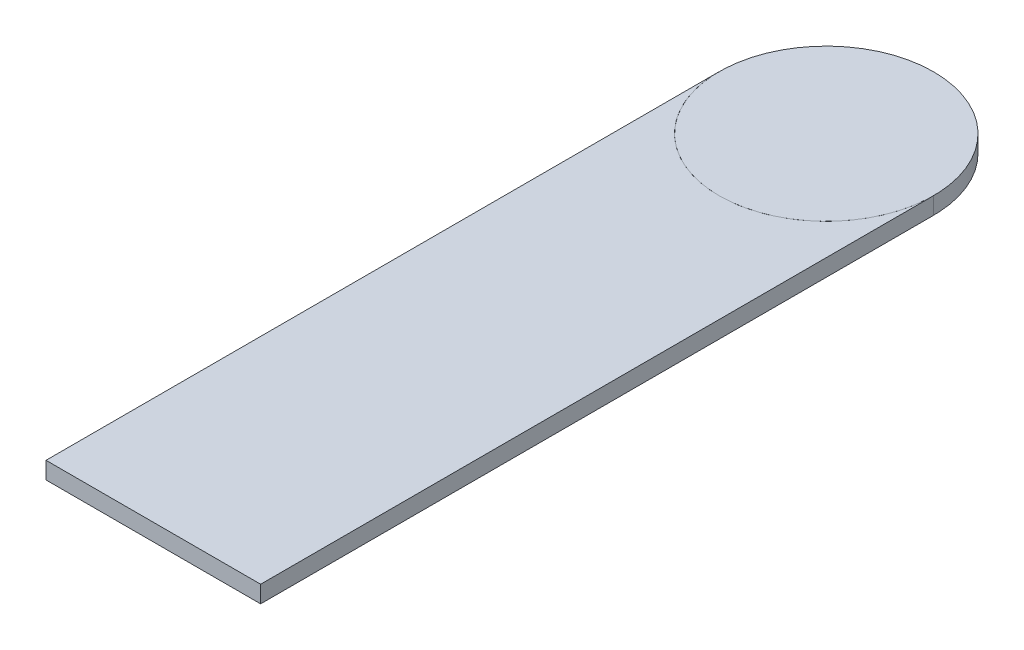
ISO-10303-21;
HEADER;
FILE_DESCRIPTION(('STEP AP214'),'2;1');
FILE_NAME('part.step','',(''),(''),'','','');
FILE_SCHEMA(('AUTOMOTIVE_DESIGN { 1 0 10303 214 1 1 1 1 }'));
ENDSEC;
DATA;
#1=APPLICATION_CONTEXT('core data for automotive mechanical design processes');
#2=APPLICATION_PROTOCOL_DEFINITION('international standard','automotive_design',2000,#1);
#3=PRODUCT_CONTEXT('',#1,'mechanical');
#4=PRODUCT('Part','Part','',(#3));
#5=PRODUCT_RELATED_PRODUCT_CATEGORY('part','',(#4));
#6=PRODUCT_DEFINITION_FORMATION('','',#4);
#7=PRODUCT_DEFINITION_CONTEXT('part definition',#1,'design');
#8=PRODUCT_DEFINITION('design','',#6,#7);
#9=PRODUCT_DEFINITION_SHAPE('','',#8);
#10=(LENGTH_UNIT() NAMED_UNIT(*) SI_UNIT(.MILLI.,.METRE.));
#11=(NAMED_UNIT(*) PLANE_ANGLE_UNIT() SI_UNIT($,.RADIAN.));
#12=(NAMED_UNIT(*) SI_UNIT($,.STERADIAN.) SOLID_ANGLE_UNIT());
#13=UNCERTAINTY_MEASURE_WITH_UNIT(LENGTH_MEASURE(1.E-05),#10,'distance_accuracy_value','');
#14=(GEOMETRIC_REPRESENTATION_CONTEXT(3) GLOBAL_UNCERTAINTY_ASSIGNED_CONTEXT((#13)) GLOBAL_UNIT_ASSIGNED_CONTEXT((#10,
#11,#12)) REPRESENTATION_CONTEXT('',''));
#15=CARTESIAN_POINT('',(0.,0.,0.));
#16=DIRECTION('',(0.,0.,1.));
#17=DIRECTION('',(1.,0.,0.));
#18=AXIS2_PLACEMENT_3D('',#15,#16,#17);
#19=CARTESIAN_POINT('',(-62.9999633347651,-0.01,0.057969244940258));
#20=DIRECTION('',(-1.,0.,0.));
#21=DIRECTION('',(0.,0.,1.));
#22=AXIS2_PLACEMENT_3D('',#19,#20,#21);
#23=PLANE('',#22);
#24=DIRECTION('',(0.,0.,1.));
#25=VECTOR('',#24,1.);
#26=CARTESIAN_POINT('',(-62.9999633347651,10.,197.56796924494));
#27=LINE('',#26,#25);
#28=CARTESIAN_POINT('',(-62.9999633347651,10.,0.0679692449402471));
#29=VERTEX_POINT('',#28);
#30=CARTESIAN_POINT('',(-62.9999633347651,10.,395.06796924494));
#31=VERTEX_POINT('',#30);
#32=EDGE_CURVE('P0_E73',#29,#31,#27,.T.);
#33=ORIENTED_EDGE('',*,*,#32,.F.);
#34=DIRECTION('',(0.,1.,0.));
#35=VECTOR('',#34,1.);
#36=CARTESIAN_POINT('',(-62.9999633347651,5.,0.0679692449402497));
#37=LINE('',#36,#35);
#38=CARTESIAN_POINT('',(-62.9999633347651,0.,0.0679692449402471));
#39=VERTEX_POINT('',#38);
#40=EDGE_CURVE('P0_E72',#39,#29,#37,.T.);
#41=ORIENTED_EDGE('',*,*,#40,.F.);
#42=DIRECTION('',(0.,0.,-1.));
#43=VECTOR('',#42,1.);
#44=CARTESIAN_POINT('',(-62.9999633347651,0.,197.56796924494));
#45=LINE('',#44,#43);
#46=CARTESIAN_POINT('',(-62.9999633347651,0.,395.06796924494));
#47=VERTEX_POINT('',#46);
#48=EDGE_CURVE('P0_E58',#47,#39,#45,.T.);
#49=ORIENTED_EDGE('',*,*,#48,.F.);
#50=DIRECTION('',(0.,-1.,0.));
#51=VECTOR('',#50,1.);
#52=CARTESIAN_POINT('',(-62.9999633347651,5.,395.06796924494));
#53=LINE('',#52,#51);
#54=EDGE_CURVE('P0_E130',#31,#47,#53,.T.);
#55=ORIENTED_EDGE('',*,*,#54,.F.);
#56=EDGE_LOOP('',(#33,#41,#49,#55));
#57=FACE_BOUND('',#56,.T.);
#58=ADVANCED_FACE('P0_F17',(#57),#23,.T.);
#59=CARTESIAN_POINT('',(63.0100366652349,0.,395.07796924494));
#60=DIRECTION('',(0.,-1.,0.));
#61=DIRECTION('',(-1.,0.,0.));
#62=AXIS2_PLACEMENT_3D('',#59,#60,#61);
#63=PLANE('',#62);
#64=DIRECTION('',(1.,0.,0.));
#65=VECTOR('',#64,1.);
#66=CARTESIAN_POINT('',(3.66652348968155E-05,0.,395.06796924494));
#67=LINE('',#66,#65);
#68=CARTESIAN_POINT('',(63.0000366652349,0.,395.06796924494));
#69=VERTEX_POINT('',#68);
#70=EDGE_CURVE('P0_E66',#47,#69,#67,.T.);
#71=ORIENTED_EDGE('',*,*,#70,.F.);
#72=ORIENTED_EDGE('',*,*,#48,.T.);
#73=CARTESIAN_POINT('',(0.,0.,0.));
#74=DIRECTION('',(0.,-1.,0.));
#75=DIRECTION('',(0.999999418012144,0.,0.0010788769038152));
#76=AXIS2_PLACEMENT_3D('',#73,#74,#75);
#77=CIRCLE('',#76,63.0000000000001);
#78=CARTESIAN_POINT('',(63.,0.,0.0679692449402843));
#79=VERTEX_POINT('',#78);
#80=EDGE_CURVE('P0_E62',#79,#39,#77,.T.);
#81=ORIENTED_EDGE('',*,*,#80,.F.);
#82=DIRECTION('',(0.,0.,-1.));
#83=VECTOR('',#82,1.);
#84=CARTESIAN_POINT('',(63.0000366652349,0.,197.56796924494));
#85=LINE('',#84,#83);
#86=EDGE_CURVE('P0_E132',#69,#79,#85,.T.);
#87=ORIENTED_EDGE('',*,*,#86,.F.);
#88=EDGE_LOOP('',(#71,#72,#81,#87));
#89=FACE_BOUND('',#88,.T.);
#90=ADVANCED_FACE('P0_F60',(#89),#63,.T.);
#91=CARTESIAN_POINT('',(0.,0.,0.));
#92=DIRECTION('',(0.,1.,0.));
#93=DIRECTION('',(0.,0.,1.));
#94=AXIS2_PLACEMENT_3D('',#91,#92,#93);
#95=CYLINDRICAL_SURFACE('',#94,63.0000000000001);
#96=CARTESIAN_POINT('',(62.9999633347651,10.,0.0679692449402913));
#97=CARTESIAN_POINT('',(62.9932738756067,10.,6.26835711270657));
#98=CARTESIAN_POINT('',(61.7778425082998,10.,12.3490151437154));
#99=CARTESIAN_POINT('',(60.5625723275097,10.,18.4288667778235));
#100=CARTESIAN_POINT('',(58.1848834643215,10.,24.1561448961404));
#101=CARTESIAN_POINT('',(55.8076163662215,10.,29.8824070842414));
#102=CARTESIAN_POINT('',(52.3589726078837,10.,35.0362382034214));
#103=CARTESIAN_POINT('',(48.9109405855209,10.,40.1891551128061));
#104=CARTESIAN_POINT('',(44.5236899726919,10.,44.571751493694));
#105=CARTESIAN_POINT('',(40.1372175900126,10.,48.9535704700207));
#106=CARTESIAN_POINT('',(34.9797289265023,10.,52.3967419237916));
#107=CARTESIAN_POINT('',(29.8231551205053,10.,55.8393026130064));
#108=CARTESIAN_POINT('',(24.0933565106366,10.,58.2109111082395));
#109=CARTESIAN_POINT('',(18.3645742764744,10.,60.582098917612));
#110=CARTESIAN_POINT('',(12.2823572692889,10.,61.791129621569));
#111=CARTESIAN_POINT('',(6.20121915170287,10.,62.9999458625021));
#112=CARTESIAN_POINT('',(0.,10.,63.));
#113=CARTESIAN_POINT('',(-6.20014439654941,10.,63.0000541281151));
#114=CARTESIAN_POINT('',(-12.282357269289,10.,61.791129621569));
#115=CARTESIAN_POINT('',(-18.3635398119834,10.,60.5824099074673));
#116=CARTESIAN_POINT('',(-24.0933565106366,10.,58.2109111082395));
#117=CARTESIAN_POINT('',(-29.8222034703282,10.,55.8398136717261));
#118=CARTESIAN_POINT('',(-34.9797289265023,10.,52.3967419237916));
#119=CARTESIAN_POINT('',(-40.1364016925297,10.,48.9542394165478));
#120=CARTESIAN_POINT('',(-44.5236899726919,10.,44.571751493694));
#121=CARTESIAN_POINT('',(-48.9102528996809,10.,40.1899881303672));
#122=CARTESIAN_POINT('',(-52.3589726078837,10.,35.0362382034214));
#123=CARTESIAN_POINT('',(-55.8071086409001,10.,29.88336051783));
#124=CARTESIAN_POINT('',(-58.1848834643215,10.,24.1561448961403));
#125=CARTESIAN_POINT('',(-60.5622554919641,10.,18.4298994665203));
#126=CARTESIAN_POINT('',(-61.7778425082998,10.,12.3490151437154));
#127=CARTESIAN_POINT('',(-62.9932732764757,10.,6.26891244079664));
#128=CARTESIAN_POINT('',(-62.9999633347651,10.,0.0679692449402358));
#129=B_SPLINE_CURVE_WITH_KNOTS('',2,(#96,#97,#98,#99,#100,#101,#102,#103,#104,#105,#106,#107,
#108,#109,#110,#111,#112,#113,#114,#115,#116,#117,#118,#119,#120,#121,#122,#123,#124,#125,#126,
#127,#128),.UNSPECIFIED.,.F.,.F.,(3,2,2,2,2,2,2,2,2,2,2,2,2,2,2,2,3),(0.,0.0625,0.125,0.1875,
0.25,0.3125,0.375,0.4375,0.5,0.5625,0.625,0.6875,0.75,0.8125,0.875,0.9375,1.),.UNSPECIFIED.);
#130=CARTESIAN_POINT('',(63.,10.,0.0679692449402843));
#131=VERTEX_POINT('',#130);
#132=EDGE_CURVE('P0_E76',#131,#29,#129,.T.);
#133=ORIENTED_EDGE('',*,*,#132,.F.);
#134=CARTESIAN_POINT('',(63.0000366652349,0.,0.0679691658258541));
#135=DIRECTION('',(0.,1.,0.));
#136=VECTOR('',#135,1.);
#137=LINE('',#134,#136);
#138=EDGE_CURVE('P0_E81',#79,#131,#137,.T.);
#139=ORIENTED_EDGE('',*,*,#138,.F.);
#140=ORIENTED_EDGE('',*,*,#80,.T.);
#141=ORIENTED_EDGE('',*,*,#40,.T.);
#142=EDGE_LOOP('',(#133,#139,#140,#141));
#143=FACE_BOUND('',#142,.T.);
#144=ADVANCED_FACE('P0_F79',(#143),#95,.F.);
#145=CARTESIAN_POINT('',(-63.0099633347651,10.,395.07796924494));
#146=DIRECTION('',(0.,1.,0.));
#147=DIRECTION('',(1.,0.,0.));
#148=AXIS2_PLACEMENT_3D('',#145,#146,#147);
#149=PLANE('',#148);
#150=DIRECTION('',(-1.,0.,0.));
#151=VECTOR('',#150,1.);
#152=CARTESIAN_POINT('',(3.66652348968155E-05,10.,395.06796924494));
#153=LINE('',#152,#151);
#154=CARTESIAN_POINT('',(63.0000366652349,10.,395.06796924494));
#155=VERTEX_POINT('',#154);
#156=EDGE_CURVE('P0_E38',#155,#31,#153,.T.);
#157=ORIENTED_EDGE('',*,*,#156,.F.);
#158=DIRECTION('',(0.,0.,1.));
#159=VECTOR('',#158,1.);
#160=CARTESIAN_POINT('',(63.0000366652349,10.,197.56796924494));
#161=LINE('',#160,#159);
#162=EDGE_CURVE('P0_E29',#131,#155,#161,.T.);
#163=ORIENTED_EDGE('',*,*,#162,.F.);
#164=ORIENTED_EDGE('',*,*,#132,.T.);
#165=ORIENTED_EDGE('',*,*,#32,.T.);
#166=EDGE_LOOP('',(#157,#163,#164,#165));
#167=FACE_BOUND('',#166,.T.);
#168=ADVANCED_FACE('P0_F102',(#167),#149,.T.);
#169=CARTESIAN_POINT('',(-63.0099633347651,-0.01,395.06796924494));
#170=DIRECTION('',(0.,0.,1.));
#171=DIRECTION('',(1.,0.,0.));
#172=AXIS2_PLACEMENT_3D('',#169,#170,#171);
#173=PLANE('',#172);
#174=ORIENTED_EDGE('',*,*,#156,.T.);
#175=ORIENTED_EDGE('',*,*,#54,.T.);
#176=ORIENTED_EDGE('',*,*,#70,.T.);
#177=DIRECTION('',(0.,-1.,0.));
#178=VECTOR('',#177,1.);
#179=CARTESIAN_POINT('',(63.0000366652349,5.,395.06796924494));
#180=LINE('',#179,#178);
#181=EDGE_CURVE('P0_E11',#155,#69,#180,.T.);
#182=ORIENTED_EDGE('',*,*,#181,.F.);
#183=EDGE_LOOP('',(#174,#175,#176,#182));
#184=FACE_BOUND('',#183,.T.);
#185=ADVANCED_FACE('P0_F161',(#184),#173,.T.);
#186=CARTESIAN_POINT('',(63.0000366652349,-0.01,395.07796924494));
#187=DIRECTION('',(1.,0.,0.));
#188=DIRECTION('',(0.,0.,-1.));
#189=AXIS2_PLACEMENT_3D('',#186,#187,#188);
#190=PLANE('',#189);
#191=ORIENTED_EDGE('',*,*,#162,.T.);
#192=ORIENTED_EDGE('',*,*,#181,.T.);
#193=ORIENTED_EDGE('',*,*,#86,.T.);
#194=ORIENTED_EDGE('',*,*,#138,.T.);
#195=EDGE_LOOP('',(#191,#192,#193,#194));
#196=FACE_BOUND('',#195,.T.);
#197=ADVANCED_FACE('P0_F19',(#196),#190,.T.);
#198=CLOSED_SHELL('',(#58,#90,#144,#168,#185,#197));
#199=MANIFOLD_SOLID_BREP('P0_B1',#198);
#200=CARTESIAN_POINT('',(-63.01,10.,63.01));
#201=DIRECTION('',(0.,1.,0.));
#202=DIRECTION('',(1.,0.,0.));
#203=AXIS2_PLACEMENT_3D('',#200,#201,#202);
#204=PLANE('',#203);
#205=CARTESIAN_POINT('',(0.,10.,0.));
#206=DIRECTION('',(0.,-1.,0.));
#207=DIRECTION('',(0.,0.,-1.));
#208=AXIS2_PLACEMENT_3D('',#205,#206,#207);
#209=CIRCLE('',#208,63.);
#210=CARTESIAN_POINT('',(0.,10.,-63.));
#211=VERTEX_POINT('',#210);
#212=EDGE_CURVE('P1_E19',#211,#211,#209,.T.);
#213=ORIENTED_EDGE('',*,*,#212,.F.);
#214=EDGE_LOOP('',(#213));
#215=FACE_BOUND('',#214,.T.);
#216=ADVANCED_FACE('P1_F15',(#215),#204,.T.);
#217=CARTESIAN_POINT('',(63.01,0.,63.01));
#218=DIRECTION('',(0.,-1.,0.));
#219=DIRECTION('',(-1.,0.,0.));
#220=AXIS2_PLACEMENT_3D('',#217,#218,#219);
#221=PLANE('',#220);
#222=CARTESIAN_POINT('',(0.,0.,0.));
#223=DIRECTION('',(0.,-1.,0.));
#224=DIRECTION('',(0.,0.,-1.));
#225=AXIS2_PLACEMENT_3D('',#222,#223,#224);
#226=CIRCLE('',#225,63.);
#227=CARTESIAN_POINT('',(0.,0.,-63.));
#228=VERTEX_POINT('',#227);
#229=EDGE_CURVE('P1_E10',#228,#228,#226,.F.);
#230=ORIENTED_EDGE('',*,*,#229,.F.);
#231=EDGE_LOOP('',(#230));
#232=FACE_BOUND('',#231,.T.);
#233=ADVANCED_FACE('P1_F30',(#232),#221,.T.);
#234=CARTESIAN_POINT('',(0.,10.,0.));
#235=DIRECTION('',(0.,-1.,0.));
#236=DIRECTION('',(0.,0.,-1.));
#237=AXIS2_PLACEMENT_3D('',#234,#235,#236);
#238=CYLINDRICAL_SURFACE('',#237,63.);
#239=ORIENTED_EDGE('',*,*,#229,.T.);
#240=EDGE_LOOP('',(#239));
#241=FACE_BOUND('',#240,.T.);
#242=ORIENTED_EDGE('',*,*,#212,.T.);
#243=EDGE_LOOP('',(#242));
#244=FACE_BOUND('',#243,.T.);
#245=ADVANCED_FACE('P1_F17',(#241,#244),#238,.T.);
#246=CLOSED_SHELL('',(#216,#233,#245));
#247=MANIFOLD_SOLID_BREP('P1_B1',#246);
#248=ADVANCED_BREP_SHAPE_REPRESENTATION('',(#18,#199,#247),#14);
#249=SHAPE_DEFINITION_REPRESENTATION(#9,#248);
ENDSEC;
END-ISO-10303-21;
